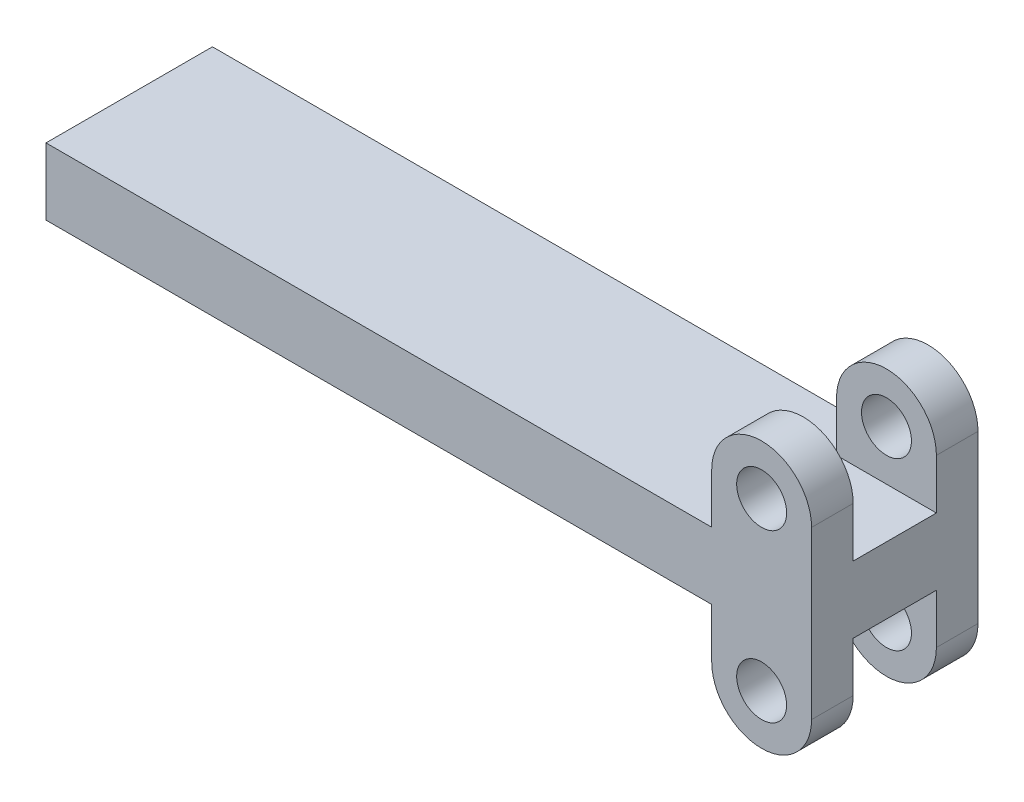
ISO-10303-21;
HEADER;
FILE_DESCRIPTION(('STEP AP214'),'2;1');
FILE_NAME('part.step','',(''),(''),'','','');
FILE_SCHEMA(('AUTOMOTIVE_DESIGN { 1 0 10303 214 1 1 1 1 }'));
ENDSEC;
DATA;
#1=APPLICATION_CONTEXT('core data for automotive mechanical design processes');
#2=APPLICATION_PROTOCOL_DEFINITION('international standard','automotive_design',2000,#1);
#3=PRODUCT_CONTEXT('',#1,'mechanical');
#4=PRODUCT('Part','Part','',(#3));
#5=PRODUCT_RELATED_PRODUCT_CATEGORY('part','',(#4));
#6=PRODUCT_DEFINITION_FORMATION('','',#4);
#7=PRODUCT_DEFINITION_CONTEXT('part definition',#1,'design');
#8=PRODUCT_DEFINITION('design','',#6,#7);
#9=PRODUCT_DEFINITION_SHAPE('','',#8);
#10=(LENGTH_UNIT() NAMED_UNIT(*) SI_UNIT(.MILLI.,.METRE.));
#11=(NAMED_UNIT(*) PLANE_ANGLE_UNIT() SI_UNIT($,.RADIAN.));
#12=(NAMED_UNIT(*) SI_UNIT($,.STERADIAN.) SOLID_ANGLE_UNIT());
#13=UNCERTAINTY_MEASURE_WITH_UNIT(LENGTH_MEASURE(1.E-05),#10,'distance_accuracy_value','');
#14=(GEOMETRIC_REPRESENTATION_CONTEXT(3) GLOBAL_UNCERTAINTY_ASSIGNED_CONTEXT((#13)) GLOBAL_UNIT_ASSIGNED_CONTEXT((#10,
#11,#12)) REPRESENTATION_CONTEXT('',''));
#15=CARTESIAN_POINT('',(0.,0.,0.));
#16=DIRECTION('',(0.,0.,1.));
#17=DIRECTION('',(1.,0.,0.));
#18=AXIS2_PLACEMENT_3D('',#15,#16,#17);
#19=CARTESIAN_POINT('',(-3.,-1.02611878961367,5.));
#20=DIRECTION('',(1.,0.,0.));
#21=DIRECTION('',(0.,1.,0.));
#22=AXIS2_PLACEMENT_3D('',#19,#20,#21);
#23=PLANE('',#22);
#24=DIRECTION('',(0.,0.,-1.));
#25=VECTOR('',#24,1.);
#26=CARTESIAN_POINT('',(-3.,-4.01611878961367,5.));
#27=LINE('',#26,#25);
#28=CARTESIAN_POINT('',(-3.,-4.01611878961367,5.));
#29=VERTEX_POINT('',#28);
#30=CARTESIAN_POINT('',(-3.,-4.01611878961367,2.5));
#31=VERTEX_POINT('',#30);
#32=EDGE_CURVE('E61',#29,#31,#27,.T.);
#33=ORIENTED_EDGE('',*,*,#32,.F.);
#34=DIRECTION('',(0.,-1.,0.));
#35=VECTOR('',#34,1.);
#36=CARTESIAN_POINT('',(-3.,-1.02611878961367,5.));
#37=LINE('',#36,#35);
#38=CARTESIAN_POINT('',(-3.,-1.02611878961367,5.));
#39=VERTEX_POINT('',#38);
#40=EDGE_CURVE('E165',#39,#29,#37,.T.);
#41=ORIENTED_EDGE('',*,*,#40,.F.);
#42=DIRECTION('',(0.,0.,-1.));
#43=VECTOR('',#42,1.);
#44=CARTESIAN_POINT('',(-3.,-1.02611878961367,5.));
#45=LINE('',#44,#43);
#46=CARTESIAN_POINT('',(-3.,-1.02611878961367,2.5));
#47=VERTEX_POINT('',#46);
#48=EDGE_CURVE('E11',#39,#47,#45,.T.);
#49=ORIENTED_EDGE('',*,*,#48,.T.);
#50=DIRECTION('',(0.,-1.,0.));
#51=VECTOR('',#50,1.);
#52=CARTESIAN_POINT('',(-3.,0.,2.5));
#53=LINE('',#52,#51);
#54=EDGE_CURVE('E220',#47,#31,#53,.T.);
#55=ORIENTED_EDGE('',*,*,#54,.T.);
#56=EDGE_LOOP('',(#33,#41,#49,#55));
#57=FACE_BOUND('',#56,.T.);
#58=ADVANCED_FACE('F36',(#57),#23,.F.);
#59=CARTESIAN_POINT('',(-3.,-4.01611878961367,-2.5));
#60=VERTEX_POINT('',#59);
#61=CARTESIAN_POINT('',(-3.,-4.01611878961367,-5.));
#62=VERTEX_POINT('',#61);
#63=EDGE_CURVE('E177',#60,#62,#27,.T.);
#64=ORIENTED_EDGE('',*,*,#63,.F.);
#65=DIRECTION('',(0.,-1.,0.));
#66=VECTOR('',#65,1.);
#67=CARTESIAN_POINT('',(-3.,0.,-2.5));
#68=LINE('',#67,#66);
#69=CARTESIAN_POINT('',(-3.,-1.02611878961367,-2.5));
#70=VERTEX_POINT('',#69);
#71=EDGE_CURVE('E205',#70,#60,#68,.T.);
#72=ORIENTED_EDGE('',*,*,#71,.F.);
#73=CARTESIAN_POINT('',(-3.,-1.02611878961367,-5.));
#74=VERTEX_POINT('',#73);
#75=EDGE_CURVE('E45',#70,#74,#45,.T.);
#76=ORIENTED_EDGE('',*,*,#75,.T.);
#77=DIRECTION('',(0.,-1.,0.));
#78=VECTOR('',#77,1.);
#79=CARTESIAN_POINT('',(-3.,-1.02611878961367,-5.));
#80=LINE('',#79,#78);
#81=EDGE_CURVE('E278',#74,#62,#80,.T.);
#82=ORIENTED_EDGE('',*,*,#81,.T.);
#83=EDGE_LOOP('',(#64,#72,#76,#82));
#84=FACE_BOUND('',#83,.T.);
#85=ADVANCED_FACE('F335',(#84),#23,.F.);
#86=DIRECTION('',(0.,0.,-1.));
#87=VECTOR('',#86,1.);
#88=CARTESIAN_POINT('',(-3.,-8.03611878961367,5.));
#89=LINE('',#88,#87);
#90=CARTESIAN_POINT('',(-3.,-8.03611878961367,5.));
#91=VERTEX_POINT('',#90);
#92=CARTESIAN_POINT('',(-3.,-8.03611878961367,-5.));
#93=VERTEX_POINT('',#92);
#94=EDGE_CURVE('E185',#91,#93,#89,.T.);
#95=ORIENTED_EDGE('',*,*,#94,.T.);
#96=CARTESIAN_POINT('',(-3.,-11.0261187896137,-5.));
#97=VERTEX_POINT('',#96);
#98=EDGE_CURVE('E277',#93,#97,#80,.T.);
#99=ORIENTED_EDGE('',*,*,#98,.T.);
#100=DIRECTION('',(0.,0.,-1.));
#101=VECTOR('',#100,1.);
#102=CARTESIAN_POINT('',(-3.,-11.0261187896137,5.));
#103=LINE('',#102,#101);
#104=CARTESIAN_POINT('',(-3.,-11.0261187896137,-2.5));
#105=VERTEX_POINT('',#104);
#106=EDGE_CURVE('E292',#105,#97,#103,.T.);
#107=ORIENTED_EDGE('',*,*,#106,.F.);
#108=DIRECTION('',(0.,-1.,0.));
#109=VECTOR('',#108,1.);
#110=CARTESIAN_POINT('',(-3.,-8.04370270593176,-2.5));
#111=LINE('',#110,#109);
#112=CARTESIAN_POINT('',(-3.,-8.04370270593176,-2.5));
#113=VERTEX_POINT('',#112);
#114=EDGE_CURVE('E238',#113,#105,#111,.T.);
#115=ORIENTED_EDGE('',*,*,#114,.F.);
#116=DIRECTION('',(0.,0.,1.));
#117=VECTOR('',#116,1.);
#118=CARTESIAN_POINT('',(-3.,-8.04370270593176,-2.5));
#119=LINE('',#118,#117);
#120=CARTESIAN_POINT('',(-3.,-8.04370270593176,2.5));
#121=VERTEX_POINT('',#120);
#122=EDGE_CURVE('E199',#113,#121,#119,.T.);
#123=ORIENTED_EDGE('',*,*,#122,.T.);
#124=DIRECTION('',(0.,-1.,0.));
#125=VECTOR('',#124,1.);
#126=CARTESIAN_POINT('',(-3.,-8.04370270593176,2.5));
#127=LINE('',#126,#125);
#128=CARTESIAN_POINT('',(-3.,-11.0261187896137,2.5));
#129=VERTEX_POINT('',#128);
#130=EDGE_CURVE('E216',#121,#129,#127,.T.);
#131=ORIENTED_EDGE('',*,*,#130,.T.);
#132=CARTESIAN_POINT('',(-3.,-11.0261187896137,5.));
#133=VERTEX_POINT('',#132);
#134=EDGE_CURVE('E293',#133,#129,#103,.T.);
#135=ORIENTED_EDGE('',*,*,#134,.F.);
#136=EDGE_CURVE('E53',#91,#133,#37,.T.);
#137=ORIENTED_EDGE('',*,*,#136,.F.);
#138=EDGE_LOOP('',(#95,#99,#107,#115,#123,#131,#135,#137));
#139=FACE_BOUND('',#138,.T.);
#140=ADVANCED_FACE('F359',(#139),#23,.F.);
#141=CARTESIAN_POINT('',(0.,-1.02611878961367,5.));
#142=DIRECTION('',(0.,0.,-1.));
#143=DIRECTION('',(-1.,0.,0.));
#144=AXIS2_PLACEMENT_3D('',#141,#142,#143);
#145=CYLINDRICAL_SURFACE('',#144,3.);
#146=CARTESIAN_POINT('',(0.,-1.02611878961367,-2.5));
#147=DIRECTION('',(0.,0.,1.));
#148=DIRECTION('',(1.,0.,0.));
#149=AXIS2_PLACEMENT_3D('',#146,#147,#148);
#150=CIRCLE('',#149,3.);
#151=CARTESIAN_POINT('',(3.,-1.02611878961367,-2.5));
#152=VERTEX_POINT('',#151);
#153=EDGE_CURVE('E202',#152,#70,#150,.T.);
#154=ORIENTED_EDGE('',*,*,#153,.F.);
#155=DIRECTION('',(0.,0.,-1.));
#156=VECTOR('',#155,1.);
#157=CARTESIAN_POINT('',(3.,-1.02611878961367,5.));
#158=LINE('',#157,#156);
#159=CARTESIAN_POINT('',(3.,-1.02611878961367,-5.));
#160=VERTEX_POINT('',#159);
#161=EDGE_CURVE('E274',#152,#160,#158,.T.);
#162=ORIENTED_EDGE('',*,*,#161,.T.);
#163=CARTESIAN_POINT('',(0.,-1.02611878961367,-5.));
#164=DIRECTION('',(0.,0.,1.));
#165=DIRECTION('',(1.,0.,0.));
#166=AXIS2_PLACEMENT_3D('',#163,#164,#165);
#167=CIRCLE('',#166,3.);
#168=EDGE_CURVE('E263',#160,#74,#167,.T.);
#169=ORIENTED_EDGE('',*,*,#168,.T.);
#170=ORIENTED_EDGE('',*,*,#75,.F.);
#171=EDGE_LOOP('',(#154,#162,#169,#170));
#172=FACE_BOUND('',#171,.T.);
#173=ADVANCED_FACE('F323',(#172),#145,.T.);
#174=CARTESIAN_POINT('',(0.,-11.0261187896137,5.));
#175=DIRECTION('',(0.,0.,-1.));
#176=DIRECTION('',(-1.,0.,0.));
#177=AXIS2_PLACEMENT_3D('',#174,#175,#176);
#178=CYLINDRICAL_SURFACE('',#177,3.);
#179=CARTESIAN_POINT('',(0.,-11.0261187896137,-2.5));
#180=DIRECTION('',(0.,0.,1.));
#181=DIRECTION('',(1.,0.,0.));
#182=AXIS2_PLACEMENT_3D('',#179,#180,#181);
#183=CIRCLE('',#182,3.);
#184=CARTESIAN_POINT('',(3.,-11.0261187896137,-2.5));
#185=VERTEX_POINT('',#184);
#186=EDGE_CURVE('E250',#105,#185,#183,.T.);
#187=ORIENTED_EDGE('',*,*,#186,.F.);
#188=ORIENTED_EDGE('',*,*,#106,.T.);
#189=CARTESIAN_POINT('',(0.,-11.0261187896137,-5.));
#190=DIRECTION('',(0.,0.,1.));
#191=DIRECTION('',(1.,0.,0.));
#192=AXIS2_PLACEMENT_3D('',#189,#190,#191);
#193=CIRCLE('',#192,3.);
#194=CARTESIAN_POINT('',(3.,-11.0261187896137,-5.));
#195=VERTEX_POINT('',#194);
#196=EDGE_CURVE('E280',#97,#195,#193,.T.);
#197=ORIENTED_EDGE('',*,*,#196,.T.);
#198=DIRECTION('',(0.,0.,-1.));
#199=VECTOR('',#198,1.);
#200=CARTESIAN_POINT('',(3.,-11.0261187896137,5.));
#201=LINE('',#200,#199);
#202=EDGE_CURVE('E288',#185,#195,#201,.T.);
#203=ORIENTED_EDGE('',*,*,#202,.F.);
#204=EDGE_LOOP('',(#187,#188,#197,#203));
#205=FACE_BOUND('',#204,.T.);
#206=ADVANCED_FACE('F369',(#205),#178,.T.);
#207=CARTESIAN_POINT('',(3.,-1.02611878961367,5.));
#208=DIRECTION('',(-1.,0.,0.));
#209=DIRECTION('',(0.,0.,1.));
#210=AXIS2_PLACEMENT_3D('',#207,#208,#209);
#211=PLANE('',#210);
#212=DIRECTION('',(0.,1.,0.));
#213=VECTOR('',#212,1.);
#214=CARTESIAN_POINT('',(3.,0.,-2.5));
#215=LINE('',#214,#213);
#216=CARTESIAN_POINT('',(3.,-4.02611878961367,-2.5));
#217=VERTEX_POINT('',#216);
#218=EDGE_CURVE('E200',#217,#152,#215,.T.);
#219=ORIENTED_EDGE('',*,*,#218,.F.);
#220=DIRECTION('',(0.,0.,1.));
#221=VECTOR('',#220,1.);
#222=CARTESIAN_POINT('',(3.,-4.02611878961367,-2.5));
#223=LINE('',#222,#221);
#224=CARTESIAN_POINT('',(3.,-4.02611878961367,2.5));
#225=VERTEX_POINT('',#224);
#226=EDGE_CURVE('E223',#217,#225,#223,.T.);
#227=ORIENTED_EDGE('',*,*,#226,.T.);
#228=DIRECTION('',(0.,1.,0.));
#229=VECTOR('',#228,1.);
#230=CARTESIAN_POINT('',(3.,0.,2.5));
#231=LINE('',#230,#229);
#232=CARTESIAN_POINT('',(3.,-1.02611878961367,2.5));
#233=VERTEX_POINT('',#232);
#234=EDGE_CURVE('E212',#225,#233,#231,.T.);
#235=ORIENTED_EDGE('',*,*,#234,.T.);
#236=CARTESIAN_POINT('',(3.,-1.02611878961367,5.));
#237=VERTEX_POINT('',#236);
#238=EDGE_CURVE('E285',#237,#233,#158,.T.);
#239=ORIENTED_EDGE('',*,*,#238,.F.);
#240=DIRECTION('',(0.,1.,0.));
#241=VECTOR('',#240,1.);
#242=CARTESIAN_POINT('',(3.,-1.02611878961367,5.));
#243=LINE('',#242,#241);
#244=CARTESIAN_POINT('',(3.,-11.0261187896137,5.));
#245=VERTEX_POINT('',#244);
#246=EDGE_CURVE('E272',#245,#237,#243,.T.);
#247=ORIENTED_EDGE('',*,*,#246,.F.);
#248=CARTESIAN_POINT('',(3.,-11.0261187896137,2.5));
#249=VERTEX_POINT('',#248);
#250=EDGE_CURVE('E289',#245,#249,#201,.T.);
#251=ORIENTED_EDGE('',*,*,#250,.T.);
#252=DIRECTION('',(0.,1.,0.));
#253=VECTOR('',#252,1.);
#254=CARTESIAN_POINT('',(3.,-11.0261187896137,2.5));
#255=LINE('',#254,#253);
#256=CARTESIAN_POINT('',(3.,-8.04370270593176,2.5));
#257=VERTEX_POINT('',#256);
#258=EDGE_CURVE('E237',#249,#257,#255,.T.);
#259=ORIENTED_EDGE('',*,*,#258,.T.);
#260=DIRECTION('',(0.,0.,1.));
#261=VECTOR('',#260,1.);
#262=CARTESIAN_POINT('',(3.,-8.04370270593176,-2.5));
#263=LINE('',#262,#261);
#264=CARTESIAN_POINT('',(3.,-8.04370270593176,-2.5));
#265=VERTEX_POINT('',#264);
#266=EDGE_CURVE('E229',#265,#257,#263,.T.);
#267=ORIENTED_EDGE('',*,*,#266,.F.);
#268=DIRECTION('',(0.,1.,0.));
#269=VECTOR('',#268,1.);
#270=CARTESIAN_POINT('',(3.,-11.0261187896137,-2.5));
#271=LINE('',#270,#269);
#272=EDGE_CURVE('E247',#185,#265,#271,.T.);
#273=ORIENTED_EDGE('',*,*,#272,.F.);
#274=ORIENTED_EDGE('',*,*,#202,.T.);
#275=DIRECTION('',(0.,1.,0.));
#276=VECTOR('',#275,1.);
#277=CARTESIAN_POINT('',(3.,-1.02611878961367,-5.));
#278=LINE('',#277,#276);
#279=EDGE_CURVE('E268',#195,#160,#278,.T.);
#280=ORIENTED_EDGE('',*,*,#279,.T.);
#281=ORIENTED_EDGE('',*,*,#161,.F.);
#282=EDGE_LOOP('',(#219,#227,#235,#239,#247,#251,#259,#267,#273,#274,#280,#281));
#283=FACE_BOUND('',#282,.T.);
#284=ADVANCED_FACE('F324',(#283),#211,.F.);
#285=CARTESIAN_POINT('',(0.,-1.02611878961367,5.));
#286=DIRECTION('',(0.,0.,-1.));
#287=DIRECTION('',(-1.,0.,0.));
#288=AXIS2_PLACEMENT_3D('',#285,#286,#287);
#289=CYLINDRICAL_SURFACE('',#288,1.5);
#290=CARTESIAN_POINT('',(0.,-1.02611878961367,-5.));
#291=DIRECTION('',(0.,0.,1.));
#292=DIRECTION('',(1.,0.,0.));
#293=AXIS2_PLACEMENT_3D('',#290,#291,#292);
#294=CIRCLE('',#293,1.5);
#295=CARTESIAN_POINT('',(1.5,-1.02611878961367,-5.));
#296=VERTEX_POINT('',#295);
#297=EDGE_CURVE('E256',#296,#296,#294,.T.);
#298=ORIENTED_EDGE('',*,*,#297,.F.);
#299=EDGE_LOOP('',(#298));
#300=FACE_BOUND('',#299,.T.);
#301=CARTESIAN_POINT('',(0.,-1.02611878961367,-2.5));
#302=DIRECTION('',(0.,0.,1.));
#303=DIRECTION('',(1.,0.,0.));
#304=AXIS2_PLACEMENT_3D('',#301,#302,#303);
#305=CIRCLE('',#304,1.5);
#306=CARTESIAN_POINT('',(1.5,-1.02611878961367,-2.5));
#307=VERTEX_POINT('',#306);
#308=EDGE_CURVE('E40',#307,#307,#305,.T.);
#309=ORIENTED_EDGE('',*,*,#308,.T.);
#310=EDGE_LOOP('',(#309));
#311=FACE_BOUND('',#310,.T.);
#312=ADVANCED_FACE('F307',(#300,#311),#289,.F.);
#313=CARTESIAN_POINT('',(0.,-11.0261187896137,5.));
#314=DIRECTION('',(0.,0.,-1.));
#315=DIRECTION('',(-1.,0.,0.));
#316=AXIS2_PLACEMENT_3D('',#313,#314,#315);
#317=CYLINDRICAL_SURFACE('',#316,1.5);
#318=CARTESIAN_POINT('',(0.,-11.0261187896137,-5.));
#319=DIRECTION('',(0.,0.,1.));
#320=DIRECTION('',(1.,0.,0.));
#321=AXIS2_PLACEMENT_3D('',#318,#319,#320);
#322=CIRCLE('',#321,1.5);
#323=CARTESIAN_POINT('',(1.5,-11.0261187896137,-5.));
#324=VERTEX_POINT('',#323);
#325=EDGE_CURVE('E257',#324,#324,#322,.T.);
#326=ORIENTED_EDGE('',*,*,#325,.F.);
#327=EDGE_LOOP('',(#326));
#328=FACE_BOUND('',#327,.T.);
#329=CARTESIAN_POINT('',(0.,-11.0261187896137,-2.5));
#330=DIRECTION('',(0.,0.,1.));
#331=DIRECTION('',(1.,0.,0.));
#332=AXIS2_PLACEMENT_3D('',#329,#330,#331);
#333=CIRCLE('',#332,1.5);
#334=CARTESIAN_POINT('',(1.5,-11.0261187896137,-2.5));
#335=VERTEX_POINT('',#334);
#336=EDGE_CURVE('E298',#335,#335,#333,.T.);
#337=ORIENTED_EDGE('',*,*,#336,.T.);
#338=EDGE_LOOP('',(#337));
#339=FACE_BOUND('',#338,.T.);
#340=ADVANCED_FACE('F404',(#328,#339),#317,.F.);
#341=CARTESIAN_POINT('',(0.,-1.02611878961367,5.));
#342=DIRECTION('',(0.,0.,1.));
#343=DIRECTION('',(1.,0.,0.));
#344=AXIS2_PLACEMENT_3D('',#341,#342,#343);
#345=PLANE('',#344);
#346=CARTESIAN_POINT('',(0.,-1.02611878961367,5.));
#347=DIRECTION('',(0.,0.,1.));
#348=DIRECTION('',(1.,0.,0.));
#349=AXIS2_PLACEMENT_3D('',#346,#347,#348);
#350=CIRCLE('',#349,1.5);
#351=CARTESIAN_POINT('',(1.5,-1.02611878961367,5.));
#352=VERTEX_POINT('',#351);
#353=EDGE_CURVE('E260',#352,#352,#350,.T.);
#354=ORIENTED_EDGE('',*,*,#353,.F.);
#355=EDGE_LOOP('',(#354));
#356=FACE_BOUND('',#355,.T.);
#357=CARTESIAN_POINT('',(0.,-1.02611878961367,5.));
#358=DIRECTION('',(0.,0.,1.));
#359=DIRECTION('',(1.,0.,0.));
#360=AXIS2_PLACEMENT_3D('',#357,#358,#359);
#361=CIRCLE('',#360,3.);
#362=EDGE_CURVE('E266',#237,#39,#361,.T.);
#363=ORIENTED_EDGE('',*,*,#362,.T.);
#364=ORIENTED_EDGE('',*,*,#40,.T.);
#365=DIRECTION('',(-1.,0.,0.));
#366=VECTOR('',#365,1.);
#367=CARTESIAN_POINT('',(-43.,-4.01611878961367,5.));
#368=LINE('',#367,#366);
#369=CARTESIAN_POINT('',(-43.,-4.01611878961367,5.));
#370=VERTEX_POINT('',#369);
#371=EDGE_CURVE('E157',#29,#370,#368,.T.);
#372=ORIENTED_EDGE('',*,*,#371,.T.);
#373=DIRECTION('',(0.,-1.,0.));
#374=VECTOR('',#373,1.);
#375=CARTESIAN_POINT('',(-43.,-8.03611878961367,5.));
#376=LINE('',#375,#374);
#377=CARTESIAN_POINT('',(-43.,-8.03611878961367,5.));
#378=VERTEX_POINT('',#377);
#379=EDGE_CURVE('E163',#370,#378,#376,.T.);
#380=ORIENTED_EDGE('',*,*,#379,.T.);
#381=DIRECTION('',(1.,0.,0.));
#382=VECTOR('',#381,1.);
#383=CARTESIAN_POINT('',(-43.,-8.03611878961367,5.));
#384=LINE('',#383,#382);
#385=EDGE_CURVE('E183',#378,#91,#384,.T.);
#386=ORIENTED_EDGE('',*,*,#385,.T.);
#387=ORIENTED_EDGE('',*,*,#136,.T.);
#388=CARTESIAN_POINT('',(0.,-11.0261187896137,5.));
#389=DIRECTION('',(0.,0.,1.));
#390=DIRECTION('',(1.,0.,0.));
#391=AXIS2_PLACEMENT_3D('',#388,#389,#390);
#392=CIRCLE('',#391,3.);
#393=EDGE_CURVE('E270',#133,#245,#392,.T.);
#394=ORIENTED_EDGE('',*,*,#393,.T.);
#395=ORIENTED_EDGE('',*,*,#246,.T.);
#396=EDGE_LOOP('',(#363,#364,#372,#380,#386,#387,#394,#395));
#397=FACE_BOUND('',#396,.T.);
#398=CARTESIAN_POINT('',(0.,-11.0261187896137,5.));
#399=DIRECTION('',(0.,0.,1.));
#400=DIRECTION('',(1.,0.,0.));
#401=AXIS2_PLACEMENT_3D('',#398,#399,#400);
#402=CIRCLE('',#401,1.5);
#403=CARTESIAN_POINT('',(1.5,-11.0261187896137,5.));
#404=VERTEX_POINT('',#403);
#405=EDGE_CURVE('E253',#404,#404,#402,.T.);
#406=ORIENTED_EDGE('',*,*,#405,.F.);
#407=EDGE_LOOP('',(#406));
#408=FACE_BOUND('',#407,.T.);
#409=ADVANCED_FACE('F160',(#356,#397,#408),#345,.T.);
#410=CARTESIAN_POINT('',(0.,-1.02611878961367,-5.));
#411=DIRECTION('',(0.,0.,1.));
#412=DIRECTION('',(1.,0.,0.));
#413=AXIS2_PLACEMENT_3D('',#410,#411,#412);
#414=PLANE('',#413);
#415=ORIENTED_EDGE('',*,*,#168,.F.);
#416=ORIENTED_EDGE('',*,*,#279,.F.);
#417=ORIENTED_EDGE('',*,*,#196,.F.);
#418=ORIENTED_EDGE('',*,*,#98,.F.);
#419=DIRECTION('',(1.,0.,0.));
#420=VECTOR('',#419,1.);
#421=CARTESIAN_POINT('',(-43.,-8.03611878961367,-5.));
#422=LINE('',#421,#420);
#423=CARTESIAN_POINT('',(-43.,-8.03611878961367,-5.));
#424=VERTEX_POINT('',#423);
#425=EDGE_CURVE('E167',#424,#93,#422,.T.);
#426=ORIENTED_EDGE('',*,*,#425,.F.);
#427=DIRECTION('',(0.,-1.,0.));
#428=VECTOR('',#427,1.);
#429=CARTESIAN_POINT('',(-43.,-8.03611878961367,-5.));
#430=LINE('',#429,#428);
#431=CARTESIAN_POINT('',(-43.,-4.01611878961367,-5.));
#432=VERTEX_POINT('',#431);
#433=EDGE_CURVE('E189',#432,#424,#430,.T.);
#434=ORIENTED_EDGE('',*,*,#433,.F.);
#435=DIRECTION('',(-1.,0.,0.));
#436=VECTOR('',#435,1.);
#437=CARTESIAN_POINT('',(-43.,-4.01611878961367,-5.));
#438=LINE('',#437,#436);
#439=EDGE_CURVE('E174',#62,#432,#438,.T.);
#440=ORIENTED_EDGE('',*,*,#439,.F.);
#441=ORIENTED_EDGE('',*,*,#81,.F.);
#442=EDGE_LOOP('',(#415,#416,#417,#418,#426,#434,#440,#441));
#443=FACE_BOUND('',#442,.T.);
#444=ORIENTED_EDGE('',*,*,#297,.T.);
#445=EDGE_LOOP('',(#444));
#446=FACE_BOUND('',#445,.T.);
#447=ORIENTED_EDGE('',*,*,#325,.T.);
#448=EDGE_LOOP('',(#447));
#449=FACE_BOUND('',#448,.T.);
#450=ADVANCED_FACE('F332',(#443,#446,#449),#414,.F.);
#451=ORIENTED_EDGE('',*,*,#238,.T.);
#452=CARTESIAN_POINT('',(0.,-1.02611878961367,2.5));
#453=DIRECTION('',(0.,0.,1.));
#454=DIRECTION('',(1.,0.,0.));
#455=AXIS2_PLACEMENT_3D('',#452,#453,#454);
#456=CIRCLE('',#455,3.);
#457=EDGE_CURVE('E215',#233,#47,#456,.T.);
#458=ORIENTED_EDGE('',*,*,#457,.T.);
#459=ORIENTED_EDGE('',*,*,#48,.F.);
#460=ORIENTED_EDGE('',*,*,#362,.F.);
#461=EDGE_LOOP('',(#451,#458,#459,#460));
#462=FACE_BOUND('',#461,.T.);
#463=ADVANCED_FACE('F38',(#462),#145,.T.);
#464=ORIENTED_EDGE('',*,*,#134,.T.);
#465=CARTESIAN_POINT('',(0.,-11.0261187896137,2.5));
#466=DIRECTION('',(0.,0.,1.));
#467=DIRECTION('',(1.,0.,0.));
#468=AXIS2_PLACEMENT_3D('',#465,#466,#467);
#469=CIRCLE('',#468,3.);
#470=EDGE_CURVE('E241',#129,#249,#469,.T.);
#471=ORIENTED_EDGE('',*,*,#470,.T.);
#472=ORIENTED_EDGE('',*,*,#250,.F.);
#473=ORIENTED_EDGE('',*,*,#393,.F.);
#474=EDGE_LOOP('',(#464,#471,#472,#473));
#475=FACE_BOUND('',#474,.T.);
#476=ADVANCED_FACE('F355',(#475),#178,.T.);
#477=CARTESIAN_POINT('',(0.,-1.02611878961367,2.5));
#478=DIRECTION('',(0.,0.,1.));
#479=DIRECTION('',(1.,0.,0.));
#480=AXIS2_PLACEMENT_3D('',#477,#478,#479);
#481=CIRCLE('',#480,1.5);
#482=CARTESIAN_POINT('',(1.5,-1.02611878961367,2.5));
#483=VERTEX_POINT('',#482);
#484=EDGE_CURVE('E300',#483,#483,#481,.T.);
#485=ORIENTED_EDGE('',*,*,#484,.F.);
#486=EDGE_LOOP('',(#485));
#487=FACE_BOUND('',#486,.T.);
#488=ORIENTED_EDGE('',*,*,#353,.T.);
#489=EDGE_LOOP('',(#488));
#490=FACE_BOUND('',#489,.T.);
#491=ADVANCED_FACE('F399',(#487,#490),#289,.F.);
#492=CARTESIAN_POINT('',(0.,-11.0261187896137,2.5));
#493=DIRECTION('',(0.,0.,1.));
#494=DIRECTION('',(1.,0.,0.));
#495=AXIS2_PLACEMENT_3D('',#492,#493,#494);
#496=CIRCLE('',#495,1.5);
#497=CARTESIAN_POINT('',(1.5,-11.0261187896137,2.5));
#498=VERTEX_POINT('',#497);
#499=EDGE_CURVE('E226',#498,#498,#496,.T.);
#500=ORIENTED_EDGE('',*,*,#499,.F.);
#501=EDGE_LOOP('',(#500));
#502=FACE_BOUND('',#501,.T.);
#503=ORIENTED_EDGE('',*,*,#405,.T.);
#504=EDGE_LOOP('',(#503));
#505=FACE_BOUND('',#504,.T.);
#506=ADVANCED_FACE('F419',(#502,#505),#317,.F.);
#507=CARTESIAN_POINT('',(-3.,-8.04370270593176,-2.5));
#508=DIRECTION('',(0.,-1.,0.));
#509=DIRECTION('',(0.,0.,-1.));
#510=AXIS2_PLACEMENT_3D('',#507,#508,#509);
#511=PLANE('',#510);
#512=DIRECTION('',(1.,0.,0.));
#513=VECTOR('',#512,1.);
#514=CARTESIAN_POINT('',(-3.,-8.04370270593176,2.5));
#515=LINE('',#514,#513);
#516=EDGE_CURVE('E235',#121,#257,#515,.T.);
#517=ORIENTED_EDGE('',*,*,#516,.F.);
#518=ORIENTED_EDGE('',*,*,#122,.F.);
#519=DIRECTION('',(1.,0.,0.));
#520=VECTOR('',#519,1.);
#521=CARTESIAN_POINT('',(-3.,-8.04370270593176,-2.5));
#522=LINE('',#521,#520);
#523=EDGE_CURVE('E232',#113,#265,#522,.T.);
#524=ORIENTED_EDGE('',*,*,#523,.T.);
#525=ORIENTED_EDGE('',*,*,#266,.T.);
#526=EDGE_LOOP('',(#517,#518,#524,#525));
#527=FACE_BOUND('',#526,.T.);
#528=ADVANCED_FACE('F364',(#527),#511,.T.);
#529=CARTESIAN_POINT('',(0.,-11.0261187896137,-2.5));
#530=DIRECTION('',(0.,0.,1.));
#531=DIRECTION('',(1.,0.,0.));
#532=AXIS2_PLACEMENT_3D('',#529,#530,#531);
#533=PLANE('',#532);
#534=ORIENTED_EDGE('',*,*,#336,.F.);
#535=EDGE_LOOP('',(#534));
#536=FACE_BOUND('',#535,.T.);
#537=ORIENTED_EDGE('',*,*,#114,.T.);
#538=ORIENTED_EDGE('',*,*,#186,.T.);
#539=ORIENTED_EDGE('',*,*,#272,.T.);
#540=ORIENTED_EDGE('',*,*,#523,.F.);
#541=EDGE_LOOP('',(#537,#538,#539,#540));
#542=FACE_BOUND('',#541,.T.);
#543=ADVANCED_FACE('F366',(#536,#542),#533,.T.);
#544=CARTESIAN_POINT('',(0.,-11.0261187896137,2.5));
#545=DIRECTION('',(0.,0.,1.));
#546=DIRECTION('',(1.,0.,0.));
#547=AXIS2_PLACEMENT_3D('',#544,#545,#546);
#548=PLANE('',#547);
#549=ORIENTED_EDGE('',*,*,#499,.T.);
#550=EDGE_LOOP('',(#549));
#551=FACE_BOUND('',#550,.T.);
#552=ORIENTED_EDGE('',*,*,#130,.F.);
#553=ORIENTED_EDGE('',*,*,#516,.T.);
#554=ORIENTED_EDGE('',*,*,#258,.F.);
#555=ORIENTED_EDGE('',*,*,#470,.F.);
#556=EDGE_LOOP('',(#552,#553,#554,#555));
#557=FACE_BOUND('',#556,.T.);
#558=ADVANCED_FACE('F358',(#551,#557),#548,.F.);
#559=CARTESIAN_POINT('',(0.,-4.02611878961367,-2.5));
#560=DIRECTION('',(0.,1.,0.));
#561=DIRECTION('',(0.,0.,1.));
#562=AXIS2_PLACEMENT_3D('',#559,#560,#561);
#563=PLANE('',#562);
#564=DIRECTION('',(-1.,0.,0.));
#565=VECTOR('',#564,1.);
#566=CARTESIAN_POINT('',(0.,-4.02611878961367,2.5));
#567=LINE('',#566,#565);
#568=CARTESIAN_POINT('',(-3.,-4.02611878961367,2.5));
#569=VERTEX_POINT('',#568);
#570=EDGE_CURVE('E203',#225,#569,#567,.T.);
#571=ORIENTED_EDGE('',*,*,#570,.F.);
#572=ORIENTED_EDGE('',*,*,#226,.F.);
#573=DIRECTION('',(-1.,0.,0.));
#574=VECTOR('',#573,1.);
#575=CARTESIAN_POINT('',(0.,-4.02611878961367,-2.5));
#576=LINE('',#575,#574);
#577=CARTESIAN_POINT('',(-3.,-4.02611878961367,-2.5));
#578=VERTEX_POINT('',#577);
#579=EDGE_CURVE('E208',#217,#578,#576,.T.);
#580=ORIENTED_EDGE('',*,*,#579,.T.);
#581=DIRECTION('',(0.,0.,1.));
#582=VECTOR('',#581,1.);
#583=CARTESIAN_POINT('',(-3.,-4.02611878961367,-2.5));
#584=LINE('',#583,#582);
#585=EDGE_CURVE('E211',#578,#569,#584,.T.);
#586=ORIENTED_EDGE('',*,*,#585,.T.);
#587=EDGE_LOOP('',(#571,#572,#580,#586));
#588=FACE_BOUND('',#587,.T.);
#589=ADVANCED_FACE('F313',(#588),#563,.T.);
#590=CARTESIAN_POINT('',(0.,0.,-2.5));
#591=DIRECTION('',(0.,0.,1.));
#592=DIRECTION('',(1.,0.,0.));
#593=AXIS2_PLACEMENT_3D('',#590,#591,#592);
#594=PLANE('',#593);
#595=ORIENTED_EDGE('',*,*,#308,.F.);
#596=EDGE_LOOP('',(#595));
#597=FACE_BOUND('',#596,.T.);
#598=ORIENTED_EDGE('',*,*,#218,.T.);
#599=ORIENTED_EDGE('',*,*,#153,.T.);
#600=ORIENTED_EDGE('',*,*,#71,.T.);
#601=DIRECTION('',(0.,-1.,0.));
#602=VECTOR('',#601,1.);
#603=CARTESIAN_POINT('',(-3.,0.,-2.5));
#604=LINE('',#603,#602);
#605=EDGE_CURVE('E196',#60,#578,#604,.T.);
#606=ORIENTED_EDGE('',*,*,#605,.T.);
#607=ORIENTED_EDGE('',*,*,#579,.F.);
#608=EDGE_LOOP('',(#598,#599,#600,#606,#607));
#609=FACE_BOUND('',#608,.T.);
#610=ADVANCED_FACE('F309',(#597,#609),#594,.T.);
#611=CARTESIAN_POINT('',(0.,0.,2.5));
#612=DIRECTION('',(0.,0.,1.));
#613=DIRECTION('',(1.,0.,0.));
#614=AXIS2_PLACEMENT_3D('',#611,#612,#613);
#615=PLANE('',#614);
#616=ORIENTED_EDGE('',*,*,#484,.T.);
#617=EDGE_LOOP('',(#616));
#618=FACE_BOUND('',#617,.T.);
#619=ORIENTED_EDGE('',*,*,#234,.F.);
#620=ORIENTED_EDGE('',*,*,#570,.T.);
#621=EDGE_CURVE('E219',#31,#569,#53,.T.);
#622=ORIENTED_EDGE('',*,*,#621,.F.);
#623=ORIENTED_EDGE('',*,*,#54,.F.);
#624=ORIENTED_EDGE('',*,*,#457,.F.);
#625=EDGE_LOOP('',(#619,#620,#622,#623,#624));
#626=FACE_BOUND('',#625,.T.);
#627=ADVANCED_FACE('F312',(#618,#626),#615,.F.);
#628=CARTESIAN_POINT('',(-3.,-8.03611878961367,5.));
#629=DIRECTION('',(-1.,0.,0.));
#630=DIRECTION('',(0.,-1.,0.));
#631=AXIS2_PLACEMENT_3D('',#628,#629,#630);
#632=PLANE('',#631);
#633=ORIENTED_EDGE('',*,*,#605,.F.);
#634=EDGE_CURVE('E197',#31,#60,#27,.T.);
#635=ORIENTED_EDGE('',*,*,#634,.F.);
#636=ORIENTED_EDGE('',*,*,#621,.T.);
#637=ORIENTED_EDGE('',*,*,#585,.F.);
#638=EDGE_LOOP('',(#633,#635,#636,#637));
#639=FACE_BOUND('',#638,.T.);
#640=ADVANCED_FACE('F341',(#639),#632,.F.);
#641=CARTESIAN_POINT('',(-43.,-4.01611878961367,5.));
#642=DIRECTION('',(0.,-1.,0.));
#643=DIRECTION('',(0.,0.,-1.));
#644=AXIS2_PLACEMENT_3D('',#641,#642,#643);
#645=PLANE('',#644);
#646=ORIENTED_EDGE('',*,*,#439,.T.);
#647=DIRECTION('',(0.,0.,-1.));
#648=VECTOR('',#647,1.);
#649=CARTESIAN_POINT('',(-43.,-4.01611878961367,5.));
#650=LINE('',#649,#648);
#651=EDGE_CURVE('E170',#370,#432,#650,.T.);
#652=ORIENTED_EDGE('',*,*,#651,.F.);
#653=ORIENTED_EDGE('',*,*,#371,.F.);
#654=ORIENTED_EDGE('',*,*,#32,.T.);
#655=ORIENTED_EDGE('',*,*,#634,.T.);
#656=ORIENTED_EDGE('',*,*,#63,.T.);
#657=EDGE_LOOP('',(#646,#652,#653,#654,#655,#656));
#658=FACE_BOUND('',#657,.T.);
#659=ADVANCED_FACE('F171',(#658),#645,.F.);
#660=CARTESIAN_POINT('',(-43.,-8.03611878961367,5.));
#661=DIRECTION('',(1.,0.,0.));
#662=DIRECTION('',(0.,0.,-1.));
#663=AXIS2_PLACEMENT_3D('',#660,#661,#662);
#664=PLANE('',#663);
#665=ORIENTED_EDGE('',*,*,#433,.T.);
#666=DIRECTION('',(0.,0.,-1.));
#667=VECTOR('',#666,1.);
#668=CARTESIAN_POINT('',(-43.,-8.03611878961367,5.));
#669=LINE('',#668,#667);
#670=EDGE_CURVE('E178',#378,#424,#669,.T.);
#671=ORIENTED_EDGE('',*,*,#670,.F.);
#672=ORIENTED_EDGE('',*,*,#379,.F.);
#673=ORIENTED_EDGE('',*,*,#651,.T.);
#674=EDGE_LOOP('',(#665,#671,#672,#673));
#675=FACE_BOUND('',#674,.T.);
#676=ADVANCED_FACE('F180',(#675),#664,.F.);
#677=CARTESIAN_POINT('',(-43.,-8.03611878961367,5.));
#678=DIRECTION('',(0.,1.,0.));
#679=DIRECTION('',(0.,0.,1.));
#680=AXIS2_PLACEMENT_3D('',#677,#678,#679);
#681=PLANE('',#680);
#682=ORIENTED_EDGE('',*,*,#425,.T.);
#683=ORIENTED_EDGE('',*,*,#94,.F.);
#684=ORIENTED_EDGE('',*,*,#385,.F.);
#685=ORIENTED_EDGE('',*,*,#670,.T.);
#686=EDGE_LOOP('',(#682,#683,#684,#685));
#687=FACE_BOUND('',#686,.T.);
#688=ADVANCED_FACE('F375',(#687),#681,.F.);
#689=CLOSED_SHELL('',(#58,#85,#140,#173,#206,#284,#312,#340,#409,#450,#463,#476,#491,#506,#528,
#543,#558,#589,#610,#627,#640,#659,#676,#688));
#690=MANIFOLD_SOLID_BREP('B2',#689);
#691=ADVANCED_BREP_SHAPE_REPRESENTATION('',(#18,#690),#14);
#692=SHAPE_DEFINITION_REPRESENTATION(#9,#691);
ENDSEC;
END-ISO-10303-21;
